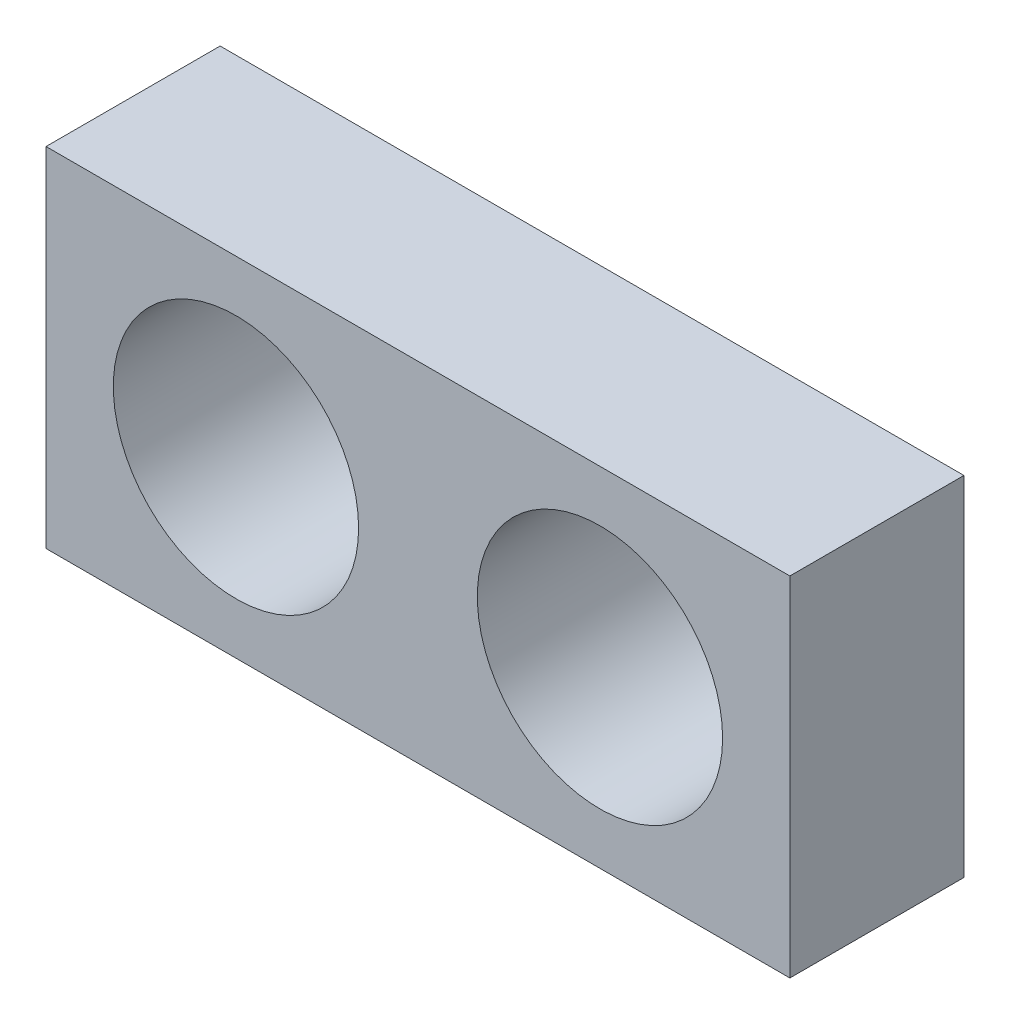
ISO-10303-21;
HEADER;
FILE_DESCRIPTION(('STEP AP214'),'2;1');
FILE_NAME('part.step','',(''),(''),'','','');
FILE_SCHEMA(('AUTOMOTIVE_DESIGN { 1 0 10303 214 1 1 1 1 }'));
ENDSEC;
DATA;
#1=APPLICATION_CONTEXT('core data for automotive mechanical design processes');
#2=APPLICATION_PROTOCOL_DEFINITION('international standard','automotive_design',2000,#1);
#3=PRODUCT_CONTEXT('',#1,'mechanical');
#4=PRODUCT('Part','Part','',(#3));
#5=PRODUCT_RELATED_PRODUCT_CATEGORY('part','',(#4));
#6=PRODUCT_DEFINITION_FORMATION('','',#4);
#7=PRODUCT_DEFINITION_CONTEXT('part definition',#1,'design');
#8=PRODUCT_DEFINITION('design','',#6,#7);
#9=PRODUCT_DEFINITION_SHAPE('','',#8);
#10=(LENGTH_UNIT() NAMED_UNIT(*) SI_UNIT(.MILLI.,.METRE.));
#11=(NAMED_UNIT(*) PLANE_ANGLE_UNIT() SI_UNIT($,.RADIAN.));
#12=(NAMED_UNIT(*) SI_UNIT($,.STERADIAN.) SOLID_ANGLE_UNIT());
#13=UNCERTAINTY_MEASURE_WITH_UNIT(LENGTH_MEASURE(1.E-05),#10,'distance_accuracy_value','');
#14=(GEOMETRIC_REPRESENTATION_CONTEXT(3) GLOBAL_UNCERTAINTY_ASSIGNED_CONTEXT((#13)) GLOBAL_UNIT_ASSIGNED_CONTEXT((#10,
#11,#12)) REPRESENTATION_CONTEXT('',''));
#15=CARTESIAN_POINT('',(0.,0.,0.));
#16=DIRECTION('',(0.,0.,1.));
#17=DIRECTION('',(1.,0.,0.));
#18=AXIS2_PLACEMENT_3D('',#15,#16,#17);
#19=CARTESIAN_POINT('',(23.5,11.,11.));
#20=DIRECTION('',(0.,-1.,0.));
#21=DIRECTION('',(0.,0.,-1.));
#22=AXIS2_PLACEMENT_3D('',#19,#20,#21);
#23=PLANE('',#22);
#24=DIRECTION('',(-1.,0.,0.));
#25=VECTOR('',#24,1.);
#26=CARTESIAN_POINT('',(23.5,11.,0.));
#27=LINE('',#26,#25);
#28=CARTESIAN_POINT('',(23.5,11.,0.));
#29=VERTEX_POINT('',#28);
#30=CARTESIAN_POINT('',(-23.5,11.,0.));
#31=VERTEX_POINT('',#30);
#32=EDGE_CURVE('E113',#29,#31,#27,.T.);
#33=ORIENTED_EDGE('',*,*,#32,.T.);
#34=DIRECTION('',(0.,0.,-1.));
#35=VECTOR('',#34,1.);
#36=CARTESIAN_POINT('',(-23.5,11.,11.));
#37=LINE('',#36,#35);
#38=CARTESIAN_POINT('',(-23.5,11.,11.));
#39=VERTEX_POINT('',#38);
#40=EDGE_CURVE('E11',#39,#31,#37,.T.);
#41=ORIENTED_EDGE('',*,*,#40,.F.);
#42=DIRECTION('',(-1.,0.,0.));
#43=VECTOR('',#42,1.);
#44=CARTESIAN_POINT('',(23.5,11.,11.));
#45=LINE('',#44,#43);
#46=CARTESIAN_POINT('',(23.5,11.,11.));
#47=VERTEX_POINT('',#46);
#48=EDGE_CURVE('E97',#47,#39,#45,.T.);
#49=ORIENTED_EDGE('',*,*,#48,.F.);
#50=DIRECTION('',(0.,0.,-1.));
#51=VECTOR('',#50,1.);
#52=CARTESIAN_POINT('',(23.5,11.,11.));
#53=LINE('',#52,#51);
#54=EDGE_CURVE('E109',#47,#29,#53,.T.);
#55=ORIENTED_EDGE('',*,*,#54,.T.);
#56=EDGE_LOOP('',(#33,#41,#49,#55));
#57=FACE_BOUND('',#56,.T.);
#58=ADVANCED_FACE('F45',(#57),#23,.F.);
#59=CARTESIAN_POINT('',(-23.5,11.,11.));
#60=DIRECTION('',(1.,0.,0.));
#61=DIRECTION('',(0.,0.,-1.));
#62=AXIS2_PLACEMENT_3D('',#59,#60,#61);
#63=PLANE('',#62);
#64=DIRECTION('',(0.,-1.,0.));
#65=VECTOR('',#64,1.);
#66=CARTESIAN_POINT('',(-23.5,11.,0.));
#67=LINE('',#66,#65);
#68=CARTESIAN_POINT('',(-23.5,-11.,0.));
#69=VERTEX_POINT('',#68);
#70=EDGE_CURVE('E102',#31,#69,#67,.T.);
#71=ORIENTED_EDGE('',*,*,#70,.T.);
#72=DIRECTION('',(0.,0.,-1.));
#73=VECTOR('',#72,1.);
#74=CARTESIAN_POINT('',(-23.5,-11.,11.));
#75=LINE('',#74,#73);
#76=CARTESIAN_POINT('',(-23.5,-11.,11.));
#77=VERTEX_POINT('',#76);
#78=EDGE_CURVE('E54',#77,#69,#75,.T.);
#79=ORIENTED_EDGE('',*,*,#78,.F.);
#80=DIRECTION('',(0.,-1.,0.));
#81=VECTOR('',#80,1.);
#82=CARTESIAN_POINT('',(-23.5,11.,11.));
#83=LINE('',#82,#81);
#84=EDGE_CURVE('E92',#39,#77,#83,.T.);
#85=ORIENTED_EDGE('',*,*,#84,.F.);
#86=ORIENTED_EDGE('',*,*,#40,.T.);
#87=EDGE_LOOP('',(#71,#79,#85,#86));
#88=FACE_BOUND('',#87,.T.);
#89=ADVANCED_FACE('F101',(#88),#63,.F.);
#90=CARTESIAN_POINT('',(-23.5,-11.,11.));
#91=DIRECTION('',(0.,1.,0.));
#92=DIRECTION('',(0.,0.,1.));
#93=AXIS2_PLACEMENT_3D('',#90,#91,#92);
#94=PLANE('',#93);
#95=DIRECTION('',(1.,0.,0.));
#96=VECTOR('',#95,1.);
#97=CARTESIAN_POINT('',(-23.5,-11.,0.));
#98=LINE('',#97,#96);
#99=CARTESIAN_POINT('',(23.5,-11.,0.));
#100=VERTEX_POINT('',#99);
#101=EDGE_CURVE('E79',#69,#100,#98,.T.);
#102=ORIENTED_EDGE('',*,*,#101,.T.);
#103=DIRECTION('',(0.,0.,-1.));
#104=VECTOR('',#103,1.);
#105=CARTESIAN_POINT('',(23.5,-11.,11.));
#106=LINE('',#105,#104);
#107=CARTESIAN_POINT('',(23.5,-11.,11.));
#108=VERTEX_POINT('',#107);
#109=EDGE_CURVE('E104',#108,#100,#106,.T.);
#110=ORIENTED_EDGE('',*,*,#109,.F.);
#111=DIRECTION('',(1.,0.,0.));
#112=VECTOR('',#111,1.);
#113=CARTESIAN_POINT('',(-23.5,-11.,11.));
#114=LINE('',#113,#112);
#115=EDGE_CURVE('E95',#77,#108,#114,.T.);
#116=ORIENTED_EDGE('',*,*,#115,.F.);
#117=ORIENTED_EDGE('',*,*,#78,.T.);
#118=EDGE_LOOP('',(#102,#110,#116,#117));
#119=FACE_BOUND('',#118,.T.);
#120=ADVANCED_FACE('F105',(#119),#94,.F.);
#121=CARTESIAN_POINT('',(23.5,-11.,11.));
#122=DIRECTION('',(-1.,0.,0.));
#123=DIRECTION('',(0.,0.,1.));
#124=AXIS2_PLACEMENT_3D('',#121,#122,#123);
#125=PLANE('',#124);
#126=DIRECTION('',(0.,1.,0.));
#127=VECTOR('',#126,1.);
#128=CARTESIAN_POINT('',(23.5,-11.,0.));
#129=LINE('',#128,#127);
#130=EDGE_CURVE('E85',#100,#29,#129,.T.);
#131=ORIENTED_EDGE('',*,*,#130,.T.);
#132=ORIENTED_EDGE('',*,*,#54,.F.);
#133=DIRECTION('',(0.,1.,0.));
#134=VECTOR('',#133,1.);
#135=CARTESIAN_POINT('',(23.5,-11.,11.));
#136=LINE('',#135,#134);
#137=EDGE_CURVE('E62',#108,#47,#136,.T.);
#138=ORIENTED_EDGE('',*,*,#137,.F.);
#139=ORIENTED_EDGE('',*,*,#109,.T.);
#140=EDGE_LOOP('',(#131,#132,#138,#139));
#141=FACE_BOUND('',#140,.T.);
#142=ADVANCED_FACE('F127',(#141),#125,.F.);
#143=CARTESIAN_POINT('',(0.,0.,11.));
#144=DIRECTION('',(0.,0.,1.));
#145=DIRECTION('',(1.,0.,0.));
#146=AXIS2_PLACEMENT_3D('',#143,#144,#145);
#147=PLANE('',#146);
#148=CARTESIAN_POINT('',(-11.5,0.,11.));
#149=DIRECTION('',(0.,0.,1.));
#150=DIRECTION('',(1.,0.,0.));
#151=AXIS2_PLACEMENT_3D('',#148,#149,#150);
#152=CIRCLE('',#151,7.75);
#153=CARTESIAN_POINT('',(-3.75,0.,11.));
#154=VERTEX_POINT('',#153);
#155=EDGE_CURVE('E138',#154,#154,#152,.T.);
#156=ORIENTED_EDGE('',*,*,#155,.F.);
#157=EDGE_LOOP('',(#156));
#158=FACE_BOUND('',#157,.T.);
#159=CARTESIAN_POINT('',(11.5,0.,11.));
#160=DIRECTION('',(0.,0.,1.));
#161=DIRECTION('',(1.,0.,0.));
#162=AXIS2_PLACEMENT_3D('',#159,#160,#161);
#163=CIRCLE('',#162,7.74999999999999);
#164=CARTESIAN_POINT('',(19.25,0.,11.));
#165=VERTEX_POINT('',#164);
#166=EDGE_CURVE('E134',#165,#165,#163,.T.);
#167=ORIENTED_EDGE('',*,*,#166,.F.);
#168=EDGE_LOOP('',(#167));
#169=FACE_BOUND('',#168,.T.);
#170=ORIENTED_EDGE('',*,*,#48,.T.);
#171=ORIENTED_EDGE('',*,*,#84,.T.);
#172=ORIENTED_EDGE('',*,*,#115,.T.);
#173=ORIENTED_EDGE('',*,*,#137,.T.);
#174=EDGE_LOOP('',(#170,#171,#172,#173));
#175=FACE_BOUND('',#174,.T.);
#176=ADVANCED_FACE('F93',(#158,#169,#175),#147,.T.);
#177=CARTESIAN_POINT('',(0.,0.,0.));
#178=DIRECTION('',(0.,0.,1.));
#179=DIRECTION('',(1.,0.,0.));
#180=AXIS2_PLACEMENT_3D('',#177,#178,#179);
#181=PLANE('',#180);
#182=CARTESIAN_POINT('',(-11.5,0.,0.));
#183=DIRECTION('',(0.,0.,1.));
#184=DIRECTION('',(1.,0.,0.));
#185=AXIS2_PLACEMENT_3D('',#182,#183,#184);
#186=CIRCLE('',#185,7.75);
#187=CARTESIAN_POINT('',(-3.75,0.,0.));
#188=VERTEX_POINT('',#187);
#189=EDGE_CURVE('E117',#188,#188,#186,.F.);
#190=ORIENTED_EDGE('',*,*,#189,.F.);
#191=EDGE_LOOP('',(#190));
#192=FACE_BOUND('',#191,.T.);
#193=CARTESIAN_POINT('',(11.5,0.,0.));
#194=DIRECTION('',(0.,0.,1.));
#195=DIRECTION('',(1.,0.,0.));
#196=AXIS2_PLACEMENT_3D('',#193,#194,#195);
#197=CIRCLE('',#196,7.74999999999999);
#198=CARTESIAN_POINT('',(19.25,0.,0.));
#199=VERTEX_POINT('',#198);
#200=EDGE_CURVE('E139',#199,#199,#197,.F.);
#201=ORIENTED_EDGE('',*,*,#200,.F.);
#202=EDGE_LOOP('',(#201));
#203=FACE_BOUND('',#202,.T.);
#204=ORIENTED_EDGE('',*,*,#32,.F.);
#205=ORIENTED_EDGE('',*,*,#130,.F.);
#206=ORIENTED_EDGE('',*,*,#101,.F.);
#207=ORIENTED_EDGE('',*,*,#70,.F.);
#208=EDGE_LOOP('',(#204,#205,#206,#207));
#209=FACE_BOUND('',#208,.T.);
#210=ADVANCED_FACE('F130',(#192,#203,#209),#181,.F.);
#211=CARTESIAN_POINT('',(11.5,0.,-21.920310216783));
#212=DIRECTION('',(0.,0.,1.));
#213=DIRECTION('',(1.,0.,0.));
#214=AXIS2_PLACEMENT_3D('',#211,#212,#213);
#215=CYLINDRICAL_SURFACE('',#214,7.74999999999999);
#216=ORIENTED_EDGE('',*,*,#200,.T.);
#217=EDGE_LOOP('',(#216));
#218=FACE_BOUND('',#217,.T.);
#219=ORIENTED_EDGE('',*,*,#166,.T.);
#220=EDGE_LOOP('',(#219));
#221=FACE_BOUND('',#220,.T.);
#222=ADVANCED_FACE('F157',(#218,#221),#215,.F.);
#223=CARTESIAN_POINT('',(-11.5,0.,-21.920310216783));
#224=DIRECTION('',(0.,0.,1.));
#225=DIRECTION('',(1.,0.,0.));
#226=AXIS2_PLACEMENT_3D('',#223,#224,#225);
#227=CYLINDRICAL_SURFACE('',#226,7.75);
#228=ORIENTED_EDGE('',*,*,#189,.T.);
#229=EDGE_LOOP('',(#228));
#230=FACE_BOUND('',#229,.T.);
#231=ORIENTED_EDGE('',*,*,#155,.T.);
#232=EDGE_LOOP('',(#231));
#233=FACE_BOUND('',#232,.T.);
#234=ADVANCED_FACE('F150',(#230,#233),#227,.F.);
#235=CLOSED_SHELL('',(#58,#89,#120,#142,#176,#210,#222,#234));
#236=MANIFOLD_SOLID_BREP('B2',#235);
#237=ADVANCED_BREP_SHAPE_REPRESENTATION('',(#18,#236),#14);
#238=SHAPE_DEFINITION_REPRESENTATION(#9,#237);
ENDSEC;
END-ISO-10303-21;
